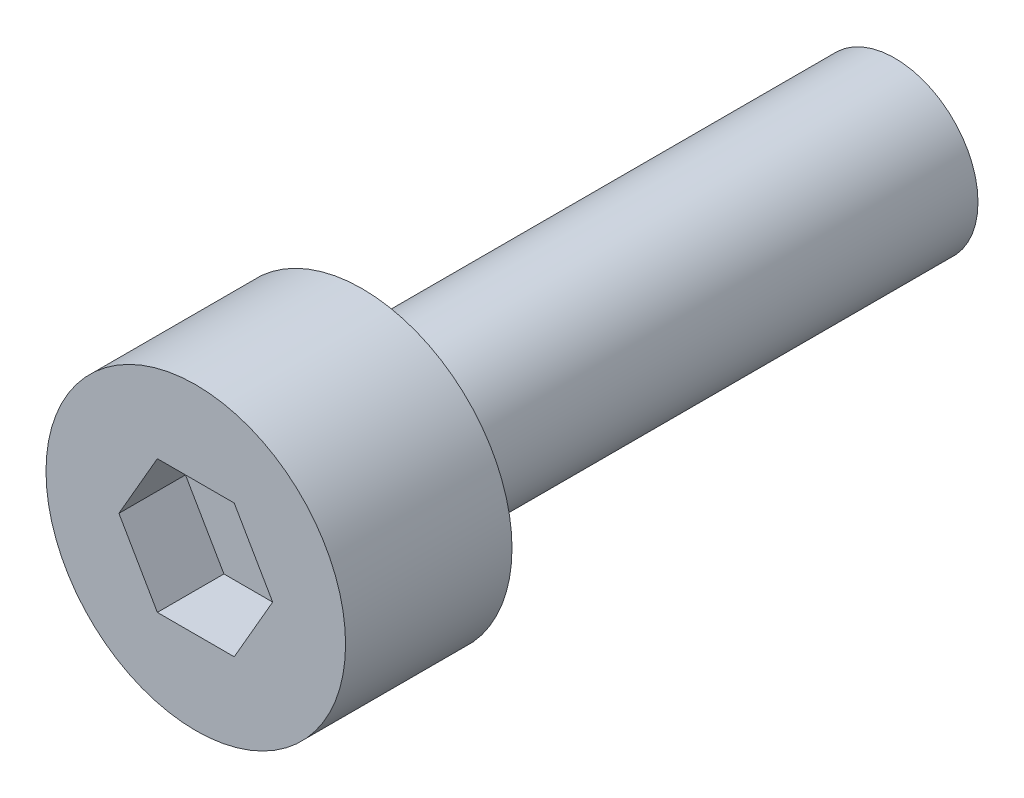
ISO-10303-21;
HEADER;
FILE_DESCRIPTION(('STEP AP214'),'2;1');
FILE_NAME('part.step','',(''),(''),'','','');
FILE_SCHEMA(('AUTOMOTIVE_DESIGN { 1 0 10303 214 1 1 1 1 }'));
ENDSEC;
DATA;
#1=APPLICATION_CONTEXT('core data for automotive mechanical design processes');
#2=APPLICATION_PROTOCOL_DEFINITION('international standard','automotive_design',2000,#1);
#3=PRODUCT_CONTEXT('',#1,'mechanical');
#4=PRODUCT('Part','Part','',(#3));
#5=PRODUCT_RELATED_PRODUCT_CATEGORY('part','',(#4));
#6=PRODUCT_DEFINITION_FORMATION('','',#4);
#7=PRODUCT_DEFINITION_CONTEXT('part definition',#1,'design');
#8=PRODUCT_DEFINITION('design','',#6,#7);
#9=PRODUCT_DEFINITION_SHAPE('','',#8);
#10=(LENGTH_UNIT() NAMED_UNIT(*) SI_UNIT(.MILLI.,.METRE.));
#11=(NAMED_UNIT(*) PLANE_ANGLE_UNIT() SI_UNIT($,.RADIAN.));
#12=(NAMED_UNIT(*) SI_UNIT($,.STERADIAN.) SOLID_ANGLE_UNIT());
#13=UNCERTAINTY_MEASURE_WITH_UNIT(LENGTH_MEASURE(1.E-05),#10,'distance_accuracy_value','');
#14=(GEOMETRIC_REPRESENTATION_CONTEXT(3) GLOBAL_UNCERTAINTY_ASSIGNED_CONTEXT((#13)) GLOBAL_UNIT_ASSIGNED_CONTEXT((#10,
#11,#12)) REPRESENTATION_CONTEXT('',''));
#15=CARTESIAN_POINT('',(0.,0.,0.));
#16=DIRECTION('',(0.,0.,1.));
#17=DIRECTION('',(1.,0.,0.));
#18=AXIS2_PLACEMENT_3D('',#15,#16,#17);
#19=CARTESIAN_POINT('',(0.,0.,-2.5));
#20=DIRECTION('',(0.,0.,1.));
#21=DIRECTION('',(-1.,0.,0.));
#22=AXIS2_PLACEMENT_3D('',#19,#20,#21);
#23=CYLINDRICAL_SURFACE('',#22,2.25);
#24=CARTESIAN_POINT('',(0.,0.,-2.5));
#25=DIRECTION('',(0.,0.,1.));
#26=DIRECTION('',(1.,0.,0.));
#27=AXIS2_PLACEMENT_3D('',#24,#25,#26);
#28=CIRCLE('',#27,2.25);
#29=CARTESIAN_POINT('',(2.25,0.,-2.5));
#30=VERTEX_POINT('',#29);
#31=EDGE_CURVE('E11',#30,#30,#28,.T.);
#32=ORIENTED_EDGE('',*,*,#31,.T.);
#33=EDGE_LOOP('',(#32));
#34=FACE_BOUND('',#33,.T.);
#35=CARTESIAN_POINT('',(0.,0.,0.));
#36=DIRECTION('',(0.,0.,1.));
#37=DIRECTION('',(1.,0.,0.));
#38=AXIS2_PLACEMENT_3D('',#35,#36,#37);
#39=CIRCLE('',#38,2.25);
#40=CARTESIAN_POINT('',(2.25,0.,0.));
#41=VERTEX_POINT('',#40);
#42=EDGE_CURVE('E42',#41,#41,#39,.T.);
#43=ORIENTED_EDGE('',*,*,#42,.F.);
#44=EDGE_LOOP('',(#43));
#45=FACE_BOUND('',#44,.T.);
#46=ADVANCED_FACE('F39',(#34,#45),#23,.T.);
#47=CARTESIAN_POINT('',(0.,0.,-2.5));
#48=DIRECTION('',(0.,0.,-1.));
#49=DIRECTION('',(1.,0.,0.));
#50=AXIS2_PLACEMENT_3D('',#47,#48,#49);
#51=PLANE('',#50);
#52=CARTESIAN_POINT('',(0.,0.,-2.5));
#53=DIRECTION('',(0.,0.,1.));
#54=DIRECTION('',(1.,0.,0.));
#55=AXIS2_PLACEMENT_3D('',#52,#53,#54);
#56=CIRCLE('',#55,1.25);
#57=CARTESIAN_POINT('',(1.25,0.,-2.5));
#58=VERTEX_POINT('',#57);
#59=EDGE_CURVE('E130',#58,#58,#56,.T.);
#60=ORIENTED_EDGE('',*,*,#59,.T.);
#61=EDGE_LOOP('',(#60));
#62=FACE_BOUND('',#61,.T.);
#63=ORIENTED_EDGE('',*,*,#31,.F.);
#64=EDGE_LOOP('',(#63));
#65=FACE_BOUND('',#64,.T.);
#66=ADVANCED_FACE('F170',(#62,#65),#51,.T.);
#67=CARTESIAN_POINT('',(0.,0.,0.));
#68=DIRECTION('',(0.,0.,-1.));
#69=DIRECTION('',(1.,0.,0.));
#70=AXIS2_PLACEMENT_3D('',#67,#68,#69);
#71=PLANE('',#70);
#72=DIRECTION('',(0.5,0.866025403784438,0.));
#73=VECTOR('',#72,1.);
#74=CARTESIAN_POINT('',(-1.15470053837925,0.,0.));
#75=LINE('',#74,#73);
#76=CARTESIAN_POINT('',(-1.15470053837925,0.,0.));
#77=VERTEX_POINT('',#76);
#78=CARTESIAN_POINT('',(-0.577350269189626,1.,0.));
#79=VERTEX_POINT('',#78);
#80=EDGE_CURVE('E145',#77,#79,#75,.T.);
#81=ORIENTED_EDGE('',*,*,#80,.T.);
#82=DIRECTION('',(1.,0.,0.));
#83=VECTOR('',#82,1.);
#84=CARTESIAN_POINT('',(-0.577350269189626,1.,0.));
#85=LINE('',#84,#83);
#86=CARTESIAN_POINT('',(0.577350269189626,1.,0.));
#87=VERTEX_POINT('',#86);
#88=EDGE_CURVE('E142',#79,#87,#85,.T.);
#89=ORIENTED_EDGE('',*,*,#88,.T.);
#90=DIRECTION('',(0.5,-0.866025403784439,0.));
#91=VECTOR('',#90,1.);
#92=CARTESIAN_POINT('',(0.577350269189626,1.,0.));
#93=LINE('',#92,#91);
#94=CARTESIAN_POINT('',(1.15470053837925,0.,0.));
#95=VERTEX_POINT('',#94);
#96=EDGE_CURVE('E140',#87,#95,#93,.T.);
#97=ORIENTED_EDGE('',*,*,#96,.T.);
#98=DIRECTION('',(-0.5,-0.866025403784438,0.));
#99=VECTOR('',#98,1.);
#100=CARTESIAN_POINT('',(1.15470053837925,0.,0.));
#101=LINE('',#100,#99);
#102=CARTESIAN_POINT('',(0.577350269189626,-1.,0.));
#103=VERTEX_POINT('',#102);
#104=EDGE_CURVE('E116',#95,#103,#101,.T.);
#105=ORIENTED_EDGE('',*,*,#104,.T.);
#106=DIRECTION('',(-1.,0.,0.));
#107=VECTOR('',#106,1.);
#108=CARTESIAN_POINT('',(0.577350269189626,-1.,0.));
#109=LINE('',#108,#107);
#110=CARTESIAN_POINT('',(-0.577350269189626,-1.,0.));
#111=VERTEX_POINT('',#110);
#112=EDGE_CURVE('E135',#103,#111,#109,.T.);
#113=ORIENTED_EDGE('',*,*,#112,.T.);
#114=DIRECTION('',(-0.5,0.866025403784439,0.));
#115=VECTOR('',#114,1.);
#116=CARTESIAN_POINT('',(-0.577350269189626,-1.,0.));
#117=LINE('',#116,#115);
#118=EDGE_CURVE('E148',#111,#77,#117,.T.);
#119=ORIENTED_EDGE('',*,*,#118,.T.);
#120=EDGE_LOOP('',(#81,#89,#97,#105,#113,#119));
#121=FACE_BOUND('',#120,.T.);
#122=ORIENTED_EDGE('',*,*,#42,.T.);
#123=EDGE_LOOP('',(#122));
#124=FACE_BOUND('',#123,.T.);
#125=ADVANCED_FACE('F156',(#121,#124),#71,.F.);
#126=CARTESIAN_POINT('',(0.,0.,-10.5));
#127=DIRECTION('',(0.,0.,1.));
#128=DIRECTION('',(-1.,0.,0.));
#129=AXIS2_PLACEMENT_3D('',#126,#127,#128);
#130=CYLINDRICAL_SURFACE('',#129,1.25);
#131=CARTESIAN_POINT('',(0.,0.,-10.5));
#132=DIRECTION('',(0.,0.,1.));
#133=DIRECTION('',(1.,0.,0.));
#134=AXIS2_PLACEMENT_3D('',#131,#132,#133);
#135=CIRCLE('',#134,1.25);
#136=CARTESIAN_POINT('',(1.25,0.,-10.5));
#137=VERTEX_POINT('',#136);
#138=EDGE_CURVE('E127',#137,#137,#135,.T.);
#139=ORIENTED_EDGE('',*,*,#138,.T.);
#140=EDGE_LOOP('',(#139));
#141=FACE_BOUND('',#140,.T.);
#142=ORIENTED_EDGE('',*,*,#59,.F.);
#143=EDGE_LOOP('',(#142));
#144=FACE_BOUND('',#143,.T.);
#145=ADVANCED_FACE('F181',(#141,#144),#130,.T.);
#146=CARTESIAN_POINT('',(0.,0.,-10.5));
#147=DIRECTION('',(0.,0.,-1.));
#148=DIRECTION('',(1.,0.,0.));
#149=AXIS2_PLACEMENT_3D('',#146,#147,#148);
#150=PLANE('',#149);
#151=ORIENTED_EDGE('',*,*,#138,.F.);
#152=EDGE_LOOP('',(#151));
#153=FACE_BOUND('',#152,.T.);
#154=ADVANCED_FACE('F166',(#153),#150,.T.);
#155=CARTESIAN_POINT('',(-0.577350269189626,-1.,-1.));
#156=DIRECTION('',(-0.866025403784439,-0.5,0.));
#157=DIRECTION('',(0.5,-0.866025403784439,0.));
#158=AXIS2_PLACEMENT_3D('',#155,#156,#157);
#159=PLANE('',#158);
#160=ORIENTED_EDGE('',*,*,#118,.F.);
#161=DIRECTION('',(0.,0.,1.));
#162=VECTOR('',#161,1.);
#163=CARTESIAN_POINT('',(-0.577350269189626,-1.,-1.));
#164=LINE('',#163,#162);
#165=CARTESIAN_POINT('',(-0.577350269189626,-1.,-1.));
#166=VERTEX_POINT('',#165);
#167=EDGE_CURVE('E84',#166,#111,#164,.T.);
#168=ORIENTED_EDGE('',*,*,#167,.F.);
#169=DIRECTION('',(-0.5,0.866025403784439,0.));
#170=VECTOR('',#169,1.);
#171=CARTESIAN_POINT('',(-0.577350269189626,-1.,-1.));
#172=LINE('',#171,#170);
#173=CARTESIAN_POINT('',(-1.15470053837925,0.,-1.));
#174=VERTEX_POINT('',#173);
#175=EDGE_CURVE('E138',#166,#174,#172,.T.);
#176=ORIENTED_EDGE('',*,*,#175,.T.);
#177=DIRECTION('',(0.,0.,1.));
#178=VECTOR('',#177,1.);
#179=CARTESIAN_POINT('',(-1.15470053837925,0.,-1.));
#180=LINE('',#179,#178);
#181=EDGE_CURVE('E53',#174,#77,#180,.T.);
#182=ORIENTED_EDGE('',*,*,#181,.T.);
#183=EDGE_LOOP('',(#160,#168,#176,#182));
#184=FACE_BOUND('',#183,.T.);
#185=ADVANCED_FACE('F153',(#184),#159,.F.);
#186=CARTESIAN_POINT('',(0.577350269189626,-1.,-1.));
#187=DIRECTION('',(0.,-1.,0.));
#188=DIRECTION('',(0.,0.,1.));
#189=AXIS2_PLACEMENT_3D('',#186,#187,#188);
#190=PLANE('',#189);
#191=ORIENTED_EDGE('',*,*,#112,.F.);
#192=DIRECTION('',(0.,0.,1.));
#193=VECTOR('',#192,1.);
#194=CARTESIAN_POINT('',(0.577350269189626,-1.,-1.));
#195=LINE('',#194,#193);
#196=CARTESIAN_POINT('',(0.577350269189626,-1.,-1.));
#197=VERTEX_POINT('',#196);
#198=EDGE_CURVE('E118',#197,#103,#195,.T.);
#199=ORIENTED_EDGE('',*,*,#198,.F.);
#200=DIRECTION('',(-1.,0.,0.));
#201=VECTOR('',#200,1.);
#202=CARTESIAN_POINT('',(0.577350269189626,-1.,-1.));
#203=LINE('',#202,#201);
#204=EDGE_CURVE('E62',#197,#166,#203,.T.);
#205=ORIENTED_EDGE('',*,*,#204,.T.);
#206=ORIENTED_EDGE('',*,*,#167,.T.);
#207=EDGE_LOOP('',(#191,#199,#205,#206));
#208=FACE_BOUND('',#207,.T.);
#209=ADVANCED_FACE('F158',(#208),#190,.F.);
#210=CARTESIAN_POINT('',(1.15470053837925,0.,-1.));
#211=DIRECTION('',(0.866025403784439,-0.5,0.));
#212=DIRECTION('',(0.5,0.866025403784439,0.));
#213=AXIS2_PLACEMENT_3D('',#210,#211,#212);
#214=PLANE('',#213);
#215=ORIENTED_EDGE('',*,*,#104,.F.);
#216=DIRECTION('',(0.,0.,1.));
#217=VECTOR('',#216,1.);
#218=CARTESIAN_POINT('',(1.15470053837925,0.,-1.));
#219=LINE('',#218,#217);
#220=CARTESIAN_POINT('',(1.15470053837925,0.,-1.));
#221=VERTEX_POINT('',#220);
#222=EDGE_CURVE('E105',#221,#95,#219,.T.);
#223=ORIENTED_EDGE('',*,*,#222,.F.);
#224=DIRECTION('',(-0.5,-0.866025403784438,0.));
#225=VECTOR('',#224,1.);
#226=CARTESIAN_POINT('',(1.15470053837925,0.,-1.));
#227=LINE('',#226,#225);
#228=EDGE_CURVE('E108',#221,#197,#227,.T.);
#229=ORIENTED_EDGE('',*,*,#228,.T.);
#230=ORIENTED_EDGE('',*,*,#198,.T.);
#231=EDGE_LOOP('',(#215,#223,#229,#230));
#232=FACE_BOUND('',#231,.T.);
#233=ADVANCED_FACE('F114',(#232),#214,.F.);
#234=CARTESIAN_POINT('',(0.577350269189626,1.,-1.));
#235=DIRECTION('',(0.866025403784439,0.5,0.));
#236=DIRECTION('',(-0.5,0.866025403784439,0.));
#237=AXIS2_PLACEMENT_3D('',#234,#235,#236);
#238=PLANE('',#237);
#239=ORIENTED_EDGE('',*,*,#96,.F.);
#240=DIRECTION('',(0.,0.,1.));
#241=VECTOR('',#240,1.);
#242=CARTESIAN_POINT('',(0.577350269189626,1.,-1.));
#243=LINE('',#242,#241);
#244=CARTESIAN_POINT('',(0.577350269189626,1.,-1.));
#245=VERTEX_POINT('',#244);
#246=EDGE_CURVE('E107',#245,#87,#243,.T.);
#247=ORIENTED_EDGE('',*,*,#246,.F.);
#248=DIRECTION('',(0.5,-0.866025403784439,0.));
#249=VECTOR('',#248,1.);
#250=CARTESIAN_POINT('',(0.577350269189626,1.,-1.));
#251=LINE('',#250,#249);
#252=EDGE_CURVE('E100',#245,#221,#251,.T.);
#253=ORIENTED_EDGE('',*,*,#252,.T.);
#254=ORIENTED_EDGE('',*,*,#222,.T.);
#255=EDGE_LOOP('',(#239,#247,#253,#254));
#256=FACE_BOUND('',#255,.T.);
#257=ADVANCED_FACE('F103',(#256),#238,.F.);
#258=CARTESIAN_POINT('',(-0.577350269189626,1.,-1.));
#259=DIRECTION('',(0.,1.,0.));
#260=DIRECTION('',(0.,0.,-1.));
#261=AXIS2_PLACEMENT_3D('',#258,#259,#260);
#262=PLANE('',#261);
#263=ORIENTED_EDGE('',*,*,#88,.F.);
#264=DIRECTION('',(0.,0.,1.));
#265=VECTOR('',#264,1.);
#266=CARTESIAN_POINT('',(-0.577350269189626,1.,-1.));
#267=LINE('',#266,#265);
#268=CARTESIAN_POINT('',(-0.577350269189626,1.,-1.));
#269=VERTEX_POINT('',#268);
#270=EDGE_CURVE('E121',#269,#79,#267,.T.);
#271=ORIENTED_EDGE('',*,*,#270,.F.);
#272=DIRECTION('',(1.,0.,0.));
#273=VECTOR('',#272,1.);
#274=CARTESIAN_POINT('',(-0.577350269189626,1.,-1.));
#275=LINE('',#274,#273);
#276=EDGE_CURVE('E109',#269,#245,#275,.T.);
#277=ORIENTED_EDGE('',*,*,#276,.T.);
#278=ORIENTED_EDGE('',*,*,#246,.T.);
#279=EDGE_LOOP('',(#263,#271,#277,#278));
#280=FACE_BOUND('',#279,.T.);
#281=ADVANCED_FACE('F194',(#280),#262,.F.);
#282=CARTESIAN_POINT('',(-1.15470053837925,0.,-1.));
#283=DIRECTION('',(-0.866025403784438,0.5,0.));
#284=DIRECTION('',(-0.5,-0.866025403784439,0.));
#285=AXIS2_PLACEMENT_3D('',#282,#283,#284);
#286=PLANE('',#285);
#287=ORIENTED_EDGE('',*,*,#80,.F.);
#288=ORIENTED_EDGE('',*,*,#181,.F.);
#289=DIRECTION('',(0.5,0.866025403784438,0.));
#290=VECTOR('',#289,1.);
#291=CARTESIAN_POINT('',(-1.15470053837925,0.,-1.));
#292=LINE('',#291,#290);
#293=EDGE_CURVE('E91',#174,#269,#292,.T.);
#294=ORIENTED_EDGE('',*,*,#293,.T.);
#295=ORIENTED_EDGE('',*,*,#270,.T.);
#296=EDGE_LOOP('',(#287,#288,#294,#295));
#297=FACE_BOUND('',#296,.T.);
#298=ADVANCED_FACE('F191',(#297),#286,.F.);
#299=CARTESIAN_POINT('',(0.,0.,-1.));
#300=DIRECTION('',(0.,0.,1.));
#301=DIRECTION('',(-1.,0.,0.));
#302=AXIS2_PLACEMENT_3D('',#299,#300,#301);
#303=PLANE('',#302);
#304=ORIENTED_EDGE('',*,*,#175,.F.);
#305=ORIENTED_EDGE('',*,*,#204,.F.);
#306=ORIENTED_EDGE('',*,*,#228,.F.);
#307=ORIENTED_EDGE('',*,*,#252,.F.);
#308=ORIENTED_EDGE('',*,*,#276,.F.);
#309=ORIENTED_EDGE('',*,*,#293,.F.);
#310=EDGE_LOOP('',(#304,#305,#306,#307,#308,#309));
#311=FACE_BOUND('',#310,.T.);
#312=ADVANCED_FACE('F111',(#311),#303,.T.);
#313=CLOSED_SHELL('',(#46,#66,#125,#145,#154,#185,#209,#233,#257,#281,#298,#312));
#314=MANIFOLD_SOLID_BREP('B2',#313);
#315=ADVANCED_BREP_SHAPE_REPRESENTATION('',(#18,#314),#14);
#316=SHAPE_DEFINITION_REPRESENTATION(#9,#315);
ENDSEC;
END-ISO-10303-21;
